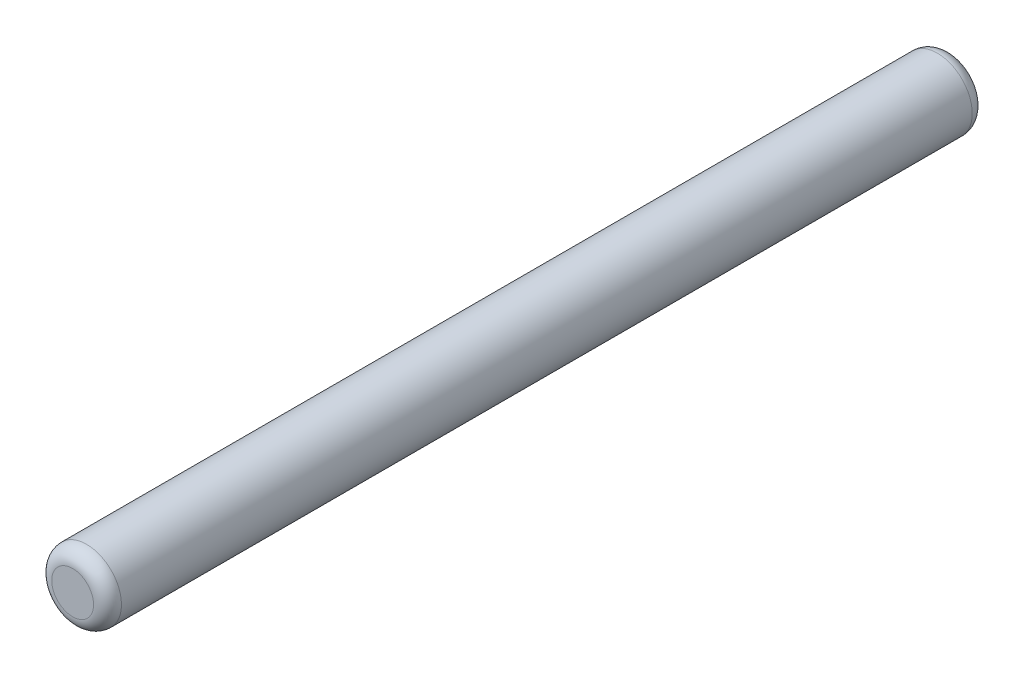
ISO-10303-21;
HEADER;
FILE_DESCRIPTION(('STEP AP214'),'2;1');
FILE_NAME('part.step','',(''),(''),'','','');
FILE_SCHEMA(('AUTOMOTIVE_DESIGN { 1 0 10303 214 1 1 1 1 }'));
ENDSEC;
DATA;
#1=APPLICATION_CONTEXT('core data for automotive mechanical design processes');
#2=APPLICATION_PROTOCOL_DEFINITION('international standard','automotive_design',2000,#1);
#3=PRODUCT_CONTEXT('',#1,'mechanical');
#4=PRODUCT('Part','Part','',(#3));
#5=PRODUCT_RELATED_PRODUCT_CATEGORY('part','',(#4));
#6=PRODUCT_DEFINITION_FORMATION('','',#4);
#7=PRODUCT_DEFINITION_CONTEXT('part definition',#1,'design');
#8=PRODUCT_DEFINITION('design','',#6,#7);
#9=PRODUCT_DEFINITION_SHAPE('','',#8);
#10=(LENGTH_UNIT() NAMED_UNIT(*) SI_UNIT(.MILLI.,.METRE.));
#11=(NAMED_UNIT(*) PLANE_ANGLE_UNIT() SI_UNIT($,.RADIAN.));
#12=(NAMED_UNIT(*) SI_UNIT($,.STERADIAN.) SOLID_ANGLE_UNIT());
#13=UNCERTAINTY_MEASURE_WITH_UNIT(LENGTH_MEASURE(1.E-05),#10,'distance_accuracy_value','');
#14=(GEOMETRIC_REPRESENTATION_CONTEXT(3) GLOBAL_UNCERTAINTY_ASSIGNED_CONTEXT((#13)) GLOBAL_UNIT_ASSIGNED_CONTEXT((#10,
#11,#12)) REPRESENTATION_CONTEXT('',''));
#15=CARTESIAN_POINT('',(0.,0.,0.));
#16=DIRECTION('',(0.,0.,1.));
#17=DIRECTION('',(1.,0.,0.));
#18=AXIS2_PLACEMENT_3D('',#15,#16,#17);
#19=CARTESIAN_POINT('',(0.,0.,40.005));
#20=DIRECTION('',(0.,0.,-1.));
#21=DIRECTION('',(-1.,0.,0.));
#22=AXIS2_PLACEMENT_3D('',#19,#20,#21);
#23=CYLINDRICAL_SURFACE('',#22,1.5875);
#24=CARTESIAN_POINT('',(0.,0.,0.634999999999997));
#25=DIRECTION('',(0.,0.,1.));
#26=DIRECTION('',(1.,0.,0.));
#27=AXIS2_PLACEMENT_3D('',#24,#25,#26);
#28=CIRCLE('',#27,1.5875);
#29=CARTESIAN_POINT('',(1.5875,0.,0.634999999999997));
#30=VERTEX_POINT('',#29);
#31=EDGE_CURVE('E42',#30,#30,#28,.T.);
#32=ORIENTED_EDGE('',*,*,#31,.T.);
#33=EDGE_LOOP('',(#32));
#34=FACE_BOUND('',#33,.T.);
#35=CARTESIAN_POINT('',(0.,0.,39.37));
#36=DIRECTION('',(0.,0.,1.));
#37=DIRECTION('',(1.,0.,0.));
#38=AXIS2_PLACEMENT_3D('',#35,#36,#37);
#39=CIRCLE('',#38,1.5875);
#40=CARTESIAN_POINT('',(1.5875,0.,39.37));
#41=VERTEX_POINT('',#40);
#42=EDGE_CURVE('E46',#41,#41,#39,.F.);
#43=ORIENTED_EDGE('',*,*,#42,.T.);
#44=EDGE_LOOP('',(#43));
#45=FACE_BOUND('',#44,.T.);
#46=ADVANCED_FACE('F31',(#34,#45),#23,.T.);
#47=CARTESIAN_POINT('',(0.,0.,40.005));
#48=DIRECTION('',(0.,0.,1.));
#49=DIRECTION('',(1.,0.,0.));
#50=AXIS2_PLACEMENT_3D('',#47,#48,#49);
#51=PLANE('',#50);
#52=CARTESIAN_POINT('',(0.,0.,40.005));
#53=DIRECTION('',(0.,0.,1.));
#54=DIRECTION('',(1.,0.,0.));
#55=AXIS2_PLACEMENT_3D('',#52,#53,#54);
#56=CIRCLE('',#55,0.9525);
#57=CARTESIAN_POINT('',(0.9525,0.,40.005));
#58=VERTEX_POINT('',#57);
#59=EDGE_CURVE('E10',#58,#58,#56,.T.);
#60=ORIENTED_EDGE('',*,*,#59,.T.);
#61=EDGE_LOOP('',(#60));
#62=FACE_BOUND('',#61,.T.);
#63=ADVANCED_FACE('F62',(#62),#51,.T.);
#64=CARTESIAN_POINT('',(0.,0.,0.));
#65=DIRECTION('',(0.,0.,1.));
#66=DIRECTION('',(1.,0.,0.));
#67=AXIS2_PLACEMENT_3D('',#64,#65,#66);
#68=PLANE('',#67);
#69=CARTESIAN_POINT('',(0.,0.,0.));
#70=DIRECTION('',(0.,0.,1.));
#71=DIRECTION('',(1.,0.,0.));
#72=AXIS2_PLACEMENT_3D('',#69,#70,#71);
#73=CIRCLE('',#72,0.9525);
#74=CARTESIAN_POINT('',(0.9525,0.,0.));
#75=VERTEX_POINT('',#74);
#76=EDGE_CURVE('E38',#75,#75,#73,.F.);
#77=ORIENTED_EDGE('',*,*,#76,.T.);
#78=EDGE_LOOP('',(#77));
#79=FACE_BOUND('',#78,.T.);
#80=ADVANCED_FACE('F59',(#79),#68,.F.);
#81=CARTESIAN_POINT('',(0.,0.,0.634999999999997));
#82=DIRECTION('',(0.,0.,1.));
#83=DIRECTION('',(1.,0.,0.));
#84=AXIS2_PLACEMENT_3D('',#81,#82,#83);
#85=TOROIDAL_SURFACE('',#84,0.9525,0.635);
#86=ORIENTED_EDGE('',*,*,#76,.F.);
#87=EDGE_LOOP('',(#86));
#88=FACE_BOUND('',#87,.T.);
#89=ORIENTED_EDGE('',*,*,#31,.F.);
#90=EDGE_LOOP('',(#89));
#91=FACE_BOUND('',#90,.T.);
#92=ADVANCED_FACE('F55',(#88,#91),#85,.T.);
#93=CARTESIAN_POINT('',(0.,0.,39.37));
#94=DIRECTION('',(0.,0.,1.));
#95=DIRECTION('',(1.,0.,0.));
#96=AXIS2_PLACEMENT_3D('',#93,#94,#95);
#97=TOROIDAL_SURFACE('',#96,0.9525,0.635);
#98=ORIENTED_EDGE('',*,*,#42,.F.);
#99=EDGE_LOOP('',(#98));
#100=FACE_BOUND('',#99,.T.);
#101=ORIENTED_EDGE('',*,*,#59,.F.);
#102=EDGE_LOOP('',(#101));
#103=FACE_BOUND('',#102,.T.);
#104=ADVANCED_FACE('F33',(#100,#103),#97,.T.);
#105=CLOSED_SHELL('',(#46,#63,#80,#92,#104));
#106=MANIFOLD_SOLID_BREP('B2',#105);
#107=ADVANCED_BREP_SHAPE_REPRESENTATION('',(#18,#106),#14);
#108=SHAPE_DEFINITION_REPRESENTATION(#9,#107);
ENDSEC;
END-ISO-10303-21;
